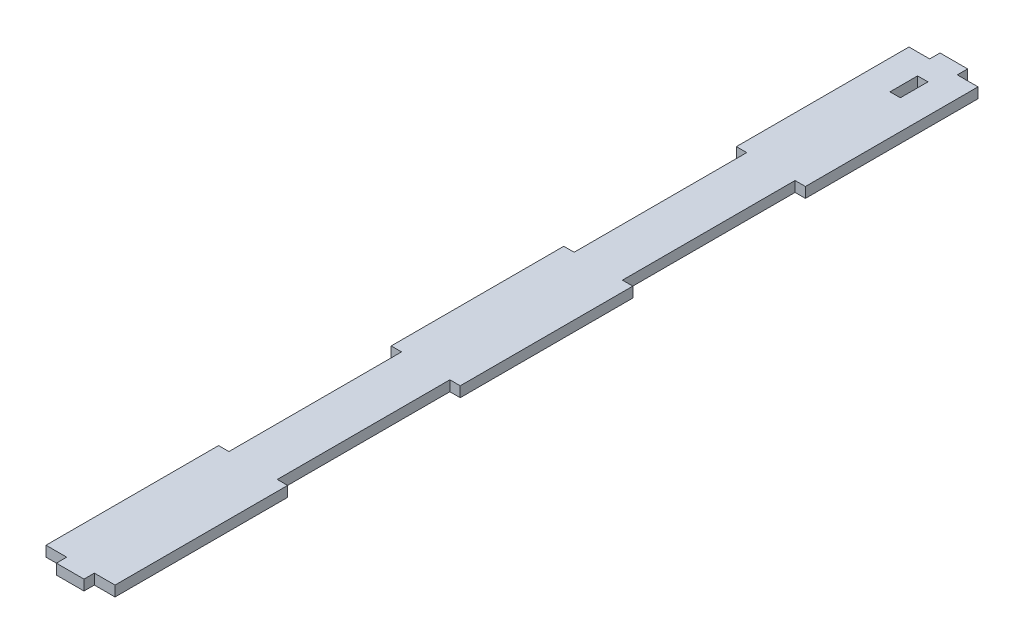
ISO-10303-21;
HEADER;
FILE_DESCRIPTION(('STEP AP214'),'2;1');
FILE_NAME('part.step','',(''),(''),'','','');
FILE_SCHEMA(('AUTOMOTIVE_DESIGN { 1 0 10303 214 1 1 1 1 }'));
ENDSEC;
DATA;
#1=APPLICATION_CONTEXT('core data for automotive mechanical design processes');
#2=APPLICATION_PROTOCOL_DEFINITION('international standard','automotive_design',2000,#1);
#3=PRODUCT_CONTEXT('',#1,'mechanical');
#4=PRODUCT('Part','Part','',(#3));
#5=PRODUCT_RELATED_PRODUCT_CATEGORY('part','',(#4));
#6=PRODUCT_DEFINITION_FORMATION('','',#4);
#7=PRODUCT_DEFINITION_CONTEXT('part definition',#1,'design');
#8=PRODUCT_DEFINITION('design','',#6,#7);
#9=PRODUCT_DEFINITION_SHAPE('','',#8);
#10=(LENGTH_UNIT() NAMED_UNIT(*) SI_UNIT(.MILLI.,.METRE.));
#11=(NAMED_UNIT(*) PLANE_ANGLE_UNIT() SI_UNIT($,.RADIAN.));
#12=(NAMED_UNIT(*) SI_UNIT($,.STERADIAN.) SOLID_ANGLE_UNIT());
#13=UNCERTAINTY_MEASURE_WITH_UNIT(LENGTH_MEASURE(1.E-05),#10,'distance_accuracy_value','');
#14=(GEOMETRIC_REPRESENTATION_CONTEXT(3) GLOBAL_UNCERTAINTY_ASSIGNED_CONTEXT((#13)) GLOBAL_UNIT_ASSIGNED_CONTEXT((#10,
#11,#12)) REPRESENTATION_CONTEXT('',''));
#15=CARTESIAN_POINT('',(0.,0.,0.));
#16=DIRECTION('',(0.,0.,1.));
#17=DIRECTION('',(1.,0.,0.));
#18=AXIS2_PLACEMENT_3D('',#15,#16,#17);
#19=CARTESIAN_POINT('',(14.,3.,0.));
#20=DIRECTION('',(1.,0.,0.));
#21=DIRECTION('',(0.,0.,-1.));
#22=AXIS2_PLACEMENT_3D('',#19,#20,#21);
#23=PLANE('',#22);
#24=DIRECTION('',(0.,0.,1.));
#25=VECTOR('',#24,1.);
#26=CARTESIAN_POINT('',(14.,0.,0.));
#27=LINE('',#26,#25);
#28=CARTESIAN_POINT('',(14.,0.,-253.));
#29=VERTEX_POINT('',#28);
#30=CARTESIAN_POINT('',(14.,0.,-250.));
#31=VERTEX_POINT('',#30);
#32=EDGE_CURVE('E428',#29,#31,#27,.T.);
#33=ORIENTED_EDGE('',*,*,#32,.F.);
#34=DIRECTION('',(0.,-1.,0.));
#35=VECTOR('',#34,1.);
#36=CARTESIAN_POINT('',(14.,3.,-253.));
#37=LINE('',#36,#35);
#38=CARTESIAN_POINT('',(14.,3.,-253.));
#39=VERTEX_POINT('',#38);
#40=EDGE_CURVE('E11',#39,#29,#37,.T.);
#41=ORIENTED_EDGE('',*,*,#40,.F.);
#42=DIRECTION('',(0.,0.,1.));
#43=VECTOR('',#42,1.);
#44=CARTESIAN_POINT('',(14.,3.,0.));
#45=LINE('',#44,#43);
#46=CARTESIAN_POINT('',(14.,3.,-250.));
#47=VERTEX_POINT('',#46);
#48=EDGE_CURVE('E510',#39,#47,#45,.T.);
#49=ORIENTED_EDGE('',*,*,#48,.T.);
#50=DIRECTION('',(0.,-1.,0.));
#51=VECTOR('',#50,1.);
#52=CARTESIAN_POINT('',(14.,3.,-250.));
#53=LINE('',#52,#51);
#54=EDGE_CURVE('E53',#47,#31,#53,.T.);
#55=ORIENTED_EDGE('',*,*,#54,.T.);
#56=EDGE_LOOP('',(#33,#41,#49,#55));
#57=FACE_BOUND('',#56,.T.);
#58=ADVANCED_FACE('F34',(#57),#23,.T.);
#59=CARTESIAN_POINT('',(0.,3.,-253.));
#60=DIRECTION('',(0.,0.,1.));
#61=DIRECTION('',(1.,0.,0.));
#62=AXIS2_PLACEMENT_3D('',#59,#60,#61);
#63=PLANE('',#62);
#64=DIRECTION('',(-1.,0.,0.));
#65=VECTOR('',#64,1.);
#66=CARTESIAN_POINT('',(0.,0.,-253.));
#67=LINE('',#66,#65);
#68=CARTESIAN_POINT('',(6.,0.,-253.));
#69=VERTEX_POINT('',#68);
#70=EDGE_CURVE('E425',#29,#69,#67,.T.);
#71=ORIENTED_EDGE('',*,*,#70,.T.);
#72=DIRECTION('',(0.,-1.,0.));
#73=VECTOR('',#72,1.);
#74=CARTESIAN_POINT('',(6.,3.,-253.));
#75=LINE('',#74,#73);
#76=CARTESIAN_POINT('',(6.,3.,-253.));
#77=VERTEX_POINT('',#76);
#78=EDGE_CURVE('E44',#77,#69,#75,.T.);
#79=ORIENTED_EDGE('',*,*,#78,.F.);
#80=DIRECTION('',(-1.,0.,0.));
#81=VECTOR('',#80,1.);
#82=CARTESIAN_POINT('',(0.,3.,-253.));
#83=LINE('',#82,#81);
#84=EDGE_CURVE('E507',#39,#77,#83,.T.);
#85=ORIENTED_EDGE('',*,*,#84,.F.);
#86=ORIENTED_EDGE('',*,*,#40,.T.);
#87=EDGE_LOOP('',(#71,#79,#85,#86));
#88=FACE_BOUND('',#87,.T.);
#89=ADVANCED_FACE('F540',(#88),#63,.F.);
#90=CARTESIAN_POINT('',(6.,3.,0.));
#91=DIRECTION('',(1.,0.,0.));
#92=DIRECTION('',(0.,0.,-1.));
#93=AXIS2_PLACEMENT_3D('',#90,#91,#92);
#94=PLANE('',#93);
#95=DIRECTION('',(0.,0.,1.));
#96=VECTOR('',#95,1.);
#97=CARTESIAN_POINT('',(6.,0.,0.));
#98=LINE('',#97,#96);
#99=CARTESIAN_POINT('',(6.,0.,-250.));
#100=VERTEX_POINT('',#99);
#101=EDGE_CURVE('E422',#69,#100,#98,.T.);
#102=ORIENTED_EDGE('',*,*,#101,.T.);
#103=DIRECTION('',(0.,-1.,0.));
#104=VECTOR('',#103,1.);
#105=CARTESIAN_POINT('',(6.,3.,-250.));
#106=LINE('',#105,#104);
#107=CARTESIAN_POINT('',(6.,3.,-250.));
#108=VERTEX_POINT('',#107);
#109=EDGE_CURVE('E333',#108,#100,#106,.T.);
#110=ORIENTED_EDGE('',*,*,#109,.F.);
#111=DIRECTION('',(0.,0.,1.));
#112=VECTOR('',#111,1.);
#113=CARTESIAN_POINT('',(6.,3.,0.));
#114=LINE('',#113,#112);
#115=EDGE_CURVE('E504',#77,#108,#114,.T.);
#116=ORIENTED_EDGE('',*,*,#115,.F.);
#117=ORIENTED_EDGE('',*,*,#78,.T.);
#118=EDGE_LOOP('',(#102,#110,#116,#117));
#119=FACE_BOUND('',#118,.T.);
#120=ADVANCED_FACE('F545',(#119),#94,.F.);
#121=CARTESIAN_POINT('',(0.,3.,-250.));
#122=DIRECTION('',(0.,0.,1.));
#123=DIRECTION('',(1.,0.,0.));
#124=AXIS2_PLACEMENT_3D('',#121,#122,#123);
#125=PLANE('',#124);
#126=DIRECTION('',(-1.,0.,0.));
#127=VECTOR('',#126,1.);
#128=CARTESIAN_POINT('',(0.,0.,-250.));
#129=LINE('',#128,#127);
#130=CARTESIAN_POINT('',(0.,0.,-250.));
#131=VERTEX_POINT('',#130);
#132=EDGE_CURVE('E419',#100,#131,#129,.T.);
#133=ORIENTED_EDGE('',*,*,#132,.T.);
#134=DIRECTION('',(0.,-1.,0.));
#135=VECTOR('',#134,1.);
#136=CARTESIAN_POINT('',(0.,3.,-250.));
#137=LINE('',#136,#135);
#138=CARTESIAN_POINT('',(0.,3.,-250.));
#139=VERTEX_POINT('',#138);
#140=EDGE_CURVE('E330',#139,#131,#137,.T.);
#141=ORIENTED_EDGE('',*,*,#140,.F.);
#142=DIRECTION('',(-1.,0.,0.));
#143=VECTOR('',#142,1.);
#144=CARTESIAN_POINT('',(0.,3.,-250.));
#145=LINE('',#144,#143);
#146=EDGE_CURVE('E501',#108,#139,#145,.T.);
#147=ORIENTED_EDGE('',*,*,#146,.F.);
#148=ORIENTED_EDGE('',*,*,#109,.T.);
#149=EDGE_LOOP('',(#133,#141,#147,#148));
#150=FACE_BOUND('',#149,.T.);
#151=ADVANCED_FACE('F551',(#150),#125,.F.);
#152=CARTESIAN_POINT('',(0.,3.,0.));
#153=DIRECTION('',(1.,0.,0.));
#154=DIRECTION('',(0.,0.,-1.));
#155=AXIS2_PLACEMENT_3D('',#152,#153,#154);
#156=PLANE('',#155);
#157=DIRECTION('',(0.,0.,1.));
#158=VECTOR('',#157,1.);
#159=CARTESIAN_POINT('',(0.,0.,0.));
#160=LINE('',#159,#158);
#161=CARTESIAN_POINT('',(0.,0.,-200.));
#162=VERTEX_POINT('',#161);
#163=EDGE_CURVE('E416',#131,#162,#160,.T.);
#164=ORIENTED_EDGE('',*,*,#163,.T.);
#165=DIRECTION('',(0.,-1.,0.));
#166=VECTOR('',#165,1.);
#167=CARTESIAN_POINT('',(0.,3.,-200.));
#168=LINE('',#167,#166);
#169=CARTESIAN_POINT('',(0.,3.,-200.));
#170=VERTEX_POINT('',#169);
#171=EDGE_CURVE('E327',#170,#162,#168,.T.);
#172=ORIENTED_EDGE('',*,*,#171,.F.);
#173=DIRECTION('',(0.,0.,1.));
#174=VECTOR('',#173,1.);
#175=CARTESIAN_POINT('',(0.,3.,0.));
#176=LINE('',#175,#174);
#177=EDGE_CURVE('E498',#139,#170,#176,.T.);
#178=ORIENTED_EDGE('',*,*,#177,.F.);
#179=ORIENTED_EDGE('',*,*,#140,.T.);
#180=EDGE_LOOP('',(#164,#172,#178,#179));
#181=FACE_BOUND('',#180,.T.);
#182=ADVANCED_FACE('F555',(#181),#156,.F.);
#183=CARTESIAN_POINT('',(3.70074341541719E-12,3.,-200.));
#184=DIRECTION('',(0.,0.,-1.));
#185=DIRECTION('',(-1.,0.,0.));
#186=AXIS2_PLACEMENT_3D('',#183,#184,#185);
#187=PLANE('',#186);
#188=DIRECTION('',(1.,0.,0.));
#189=VECTOR('',#188,1.);
#190=CARTESIAN_POINT('',(3.70074341541719E-12,0.,-200.));
#191=LINE('',#190,#189);
#192=CARTESIAN_POINT('',(3.,0.,-200.));
#193=VERTEX_POINT('',#192);
#194=EDGE_CURVE('E413',#162,#193,#191,.T.);
#195=ORIENTED_EDGE('',*,*,#194,.T.);
#196=DIRECTION('',(0.,-1.,0.));
#197=VECTOR('',#196,1.);
#198=CARTESIAN_POINT('',(3.,3.,-200.));
#199=LINE('',#198,#197);
#200=CARTESIAN_POINT('',(3.,3.,-200.));
#201=VERTEX_POINT('',#200);
#202=EDGE_CURVE('E324',#201,#193,#199,.T.);
#203=ORIENTED_EDGE('',*,*,#202,.F.);
#204=DIRECTION('',(1.,0.,0.));
#205=VECTOR('',#204,1.);
#206=CARTESIAN_POINT('',(3.70074341541719E-12,3.,-200.));
#207=LINE('',#206,#205);
#208=EDGE_CURVE('E495',#170,#201,#207,.T.);
#209=ORIENTED_EDGE('',*,*,#208,.F.);
#210=ORIENTED_EDGE('',*,*,#171,.T.);
#211=EDGE_LOOP('',(#195,#203,#209,#210));
#212=FACE_BOUND('',#211,.T.);
#213=ADVANCED_FACE('F559',(#212),#187,.F.);
#214=CARTESIAN_POINT('',(3.00000000000002,3.,0.));
#215=DIRECTION('',(1.,0.,0.));
#216=DIRECTION('',(0.,0.,-1.));
#217=AXIS2_PLACEMENT_3D('',#214,#215,#216);
#218=PLANE('',#217);
#219=DIRECTION('',(0.,0.,1.));
#220=VECTOR('',#219,1.);
#221=CARTESIAN_POINT('',(3.00000000000002,0.,0.));
#222=LINE('',#221,#220);
#223=CARTESIAN_POINT('',(3.,0.,-150.));
#224=VERTEX_POINT('',#223);
#225=EDGE_CURVE('E410',#193,#224,#222,.T.);
#226=ORIENTED_EDGE('',*,*,#225,.T.);
#227=DIRECTION('',(0.,-1.,0.));
#228=VECTOR('',#227,1.);
#229=CARTESIAN_POINT('',(3.,3.,-150.));
#230=LINE('',#229,#228);
#231=CARTESIAN_POINT('',(3.,3.,-150.));
#232=VERTEX_POINT('',#231);
#233=EDGE_CURVE('E321',#232,#224,#230,.T.);
#234=ORIENTED_EDGE('',*,*,#233,.F.);
#235=DIRECTION('',(0.,0.,1.));
#236=VECTOR('',#235,1.);
#237=CARTESIAN_POINT('',(3.00000000000002,3.,0.));
#238=LINE('',#237,#236);
#239=EDGE_CURVE('E492',#201,#232,#238,.T.);
#240=ORIENTED_EDGE('',*,*,#239,.F.);
#241=ORIENTED_EDGE('',*,*,#202,.T.);
#242=EDGE_LOOP('',(#226,#234,#240,#241));
#243=FACE_BOUND('',#242,.T.);
#244=ADVANCED_FACE('F563',(#243),#218,.F.);
#245=CARTESIAN_POINT('',(-1.38777878078144E-12,3.,-150.));
#246=DIRECTION('',(0.,0.,1.));
#247=DIRECTION('',(1.,0.,0.));
#248=AXIS2_PLACEMENT_3D('',#245,#246,#247);
#249=PLANE('',#248);
#250=DIRECTION('',(-1.,0.,0.));
#251=VECTOR('',#250,1.);
#252=CARTESIAN_POINT('',(-1.38777878078144E-12,0.,-150.));
#253=LINE('',#252,#251);
#254=CARTESIAN_POINT('',(0.,0.,-150.));
#255=VERTEX_POINT('',#254);
#256=EDGE_CURVE('E407',#224,#255,#253,.T.);
#257=ORIENTED_EDGE('',*,*,#256,.T.);
#258=DIRECTION('',(0.,-1.,0.));
#259=VECTOR('',#258,1.);
#260=CARTESIAN_POINT('',(0.,3.,-150.));
#261=LINE('',#260,#259);
#262=CARTESIAN_POINT('',(0.,3.,-150.));
#263=VERTEX_POINT('',#262);
#264=EDGE_CURVE('E318',#263,#255,#261,.T.);
#265=ORIENTED_EDGE('',*,*,#264,.F.);
#266=DIRECTION('',(-1.,0.,0.));
#267=VECTOR('',#266,1.);
#268=CARTESIAN_POINT('',(-1.38777878078144E-12,3.,-150.));
#269=LINE('',#268,#267);
#270=EDGE_CURVE('E489',#232,#263,#269,.T.);
#271=ORIENTED_EDGE('',*,*,#270,.F.);
#272=ORIENTED_EDGE('',*,*,#233,.T.);
#273=EDGE_LOOP('',(#257,#265,#271,#272));
#274=FACE_BOUND('',#273,.T.);
#275=ADVANCED_FACE('F567',(#274),#249,.F.);
#276=CARTESIAN_POINT('',(0.,3.,0.));
#277=DIRECTION('',(1.,0.,0.));
#278=DIRECTION('',(0.,0.,-1.));
#279=AXIS2_PLACEMENT_3D('',#276,#277,#278);
#280=PLANE('',#279);
#281=DIRECTION('',(0.,0.,1.));
#282=VECTOR('',#281,1.);
#283=CARTESIAN_POINT('',(0.,0.,0.));
#284=LINE('',#283,#282);
#285=CARTESIAN_POINT('',(0.,0.,-100.));
#286=VERTEX_POINT('',#285);
#287=EDGE_CURVE('E404',#255,#286,#284,.T.);
#288=ORIENTED_EDGE('',*,*,#287,.T.);
#289=DIRECTION('',(0.,-1.,0.));
#290=VECTOR('',#289,1.);
#291=CARTESIAN_POINT('',(0.,3.,-100.));
#292=LINE('',#291,#290);
#293=CARTESIAN_POINT('',(0.,3.,-100.));
#294=VERTEX_POINT('',#293);
#295=EDGE_CURVE('E315',#294,#286,#292,.T.);
#296=ORIENTED_EDGE('',*,*,#295,.F.);
#297=DIRECTION('',(0.,0.,1.));
#298=VECTOR('',#297,1.);
#299=CARTESIAN_POINT('',(0.,3.,0.));
#300=LINE('',#299,#298);
#301=EDGE_CURVE('E486',#263,#294,#300,.T.);
#302=ORIENTED_EDGE('',*,*,#301,.F.);
#303=ORIENTED_EDGE('',*,*,#264,.T.);
#304=EDGE_LOOP('',(#288,#296,#302,#303));
#305=FACE_BOUND('',#304,.T.);
#306=ADVANCED_FACE('F571',(#305),#280,.F.);
#307=CARTESIAN_POINT('',(0.,3.,-100.));
#308=DIRECTION('',(0.,0.,-1.));
#309=DIRECTION('',(-1.,0.,0.));
#310=AXIS2_PLACEMENT_3D('',#307,#308,#309);
#311=PLANE('',#310);
#312=DIRECTION('',(1.,0.,0.));
#313=VECTOR('',#312,1.);
#314=CARTESIAN_POINT('',(0.,0.,-100.));
#315=LINE('',#314,#313);
#316=CARTESIAN_POINT('',(3.,0.,-100.));
#317=VERTEX_POINT('',#316);
#318=EDGE_CURVE('E401',#286,#317,#315,.T.);
#319=ORIENTED_EDGE('',*,*,#318,.T.);
#320=DIRECTION('',(0.,-1.,0.));
#321=VECTOR('',#320,1.);
#322=CARTESIAN_POINT('',(3.,3.,-100.));
#323=LINE('',#322,#321);
#324=CARTESIAN_POINT('',(3.,3.,-100.));
#325=VERTEX_POINT('',#324);
#326=EDGE_CURVE('E312',#325,#317,#323,.T.);
#327=ORIENTED_EDGE('',*,*,#326,.F.);
#328=DIRECTION('',(1.,0.,0.));
#329=VECTOR('',#328,1.);
#330=CARTESIAN_POINT('',(0.,3.,-100.));
#331=LINE('',#330,#329);
#332=EDGE_CURVE('E483',#294,#325,#331,.T.);
#333=ORIENTED_EDGE('',*,*,#332,.F.);
#334=ORIENTED_EDGE('',*,*,#295,.T.);
#335=EDGE_LOOP('',(#319,#327,#333,#334));
#336=FACE_BOUND('',#335,.T.);
#337=ADVANCED_FACE('F575',(#336),#311,.F.);
#338=CARTESIAN_POINT('',(3.,3.,0.));
#339=DIRECTION('',(1.,0.,0.));
#340=DIRECTION('',(0.,0.,-1.));
#341=AXIS2_PLACEMENT_3D('',#338,#339,#340);
#342=PLANE('',#341);
#343=DIRECTION('',(0.,0.,1.));
#344=VECTOR('',#343,1.);
#345=CARTESIAN_POINT('',(3.,0.,0.));
#346=LINE('',#345,#344);
#347=CARTESIAN_POINT('',(3.,0.,-50.));
#348=VERTEX_POINT('',#347);
#349=EDGE_CURVE('E398',#317,#348,#346,.T.);
#350=ORIENTED_EDGE('',*,*,#349,.T.);
#351=DIRECTION('',(0.,-1.,0.));
#352=VECTOR('',#351,1.);
#353=CARTESIAN_POINT('',(3.,3.,-50.));
#354=LINE('',#353,#352);
#355=CARTESIAN_POINT('',(3.,3.,-50.));
#356=VERTEX_POINT('',#355);
#357=EDGE_CURVE('E309',#356,#348,#354,.T.);
#358=ORIENTED_EDGE('',*,*,#357,.F.);
#359=DIRECTION('',(0.,0.,1.));
#360=VECTOR('',#359,1.);
#361=CARTESIAN_POINT('',(3.,3.,0.));
#362=LINE('',#361,#360);
#363=EDGE_CURVE('E480',#325,#356,#362,.T.);
#364=ORIENTED_EDGE('',*,*,#363,.F.);
#365=ORIENTED_EDGE('',*,*,#326,.T.);
#366=EDGE_LOOP('',(#350,#358,#364,#365));
#367=FACE_BOUND('',#366,.T.);
#368=ADVANCED_FACE('F579',(#367),#342,.F.);
#369=CARTESIAN_POINT('',(0.,3.,-50.));
#370=DIRECTION('',(0.,0.,1.));
#371=DIRECTION('',(1.,0.,0.));
#372=AXIS2_PLACEMENT_3D('',#369,#370,#371);
#373=PLANE('',#372);
#374=DIRECTION('',(-1.,0.,0.));
#375=VECTOR('',#374,1.);
#376=CARTESIAN_POINT('',(0.,0.,-50.));
#377=LINE('',#376,#375);
#378=CARTESIAN_POINT('',(0.,0.,-50.));
#379=VERTEX_POINT('',#378);
#380=EDGE_CURVE('E395',#348,#379,#377,.T.);
#381=ORIENTED_EDGE('',*,*,#380,.T.);
#382=DIRECTION('',(0.,-1.,0.));
#383=VECTOR('',#382,1.);
#384=CARTESIAN_POINT('',(0.,3.,-50.));
#385=LINE('',#384,#383);
#386=CARTESIAN_POINT('',(0.,3.,-50.));
#387=VERTEX_POINT('',#386);
#388=EDGE_CURVE('E306',#387,#379,#385,.T.);
#389=ORIENTED_EDGE('',*,*,#388,.F.);
#390=DIRECTION('',(-1.,0.,0.));
#391=VECTOR('',#390,1.);
#392=CARTESIAN_POINT('',(0.,3.,-50.));
#393=LINE('',#392,#391);
#394=EDGE_CURVE('E477',#356,#387,#393,.T.);
#395=ORIENTED_EDGE('',*,*,#394,.F.);
#396=ORIENTED_EDGE('',*,*,#357,.T.);
#397=EDGE_LOOP('',(#381,#389,#395,#396));
#398=FACE_BOUND('',#397,.T.);
#399=ADVANCED_FACE('F583',(#398),#373,.F.);
#400=CARTESIAN_POINT('',(0.,3.,0.));
#401=DIRECTION('',(1.,0.,0.));
#402=DIRECTION('',(0.,0.,-1.));
#403=AXIS2_PLACEMENT_3D('',#400,#401,#402);
#404=PLANE('',#403);
#405=DIRECTION('',(0.,0.,1.));
#406=VECTOR('',#405,1.);
#407=CARTESIAN_POINT('',(0.,0.,0.));
#408=LINE('',#407,#406);
#409=CARTESIAN_POINT('',(0.,0.,0.));
#410=VERTEX_POINT('',#409);
#411=EDGE_CURVE('E392',#379,#410,#408,.T.);
#412=ORIENTED_EDGE('',*,*,#411,.T.);
#413=DIRECTION('',(0.,-1.,0.));
#414=VECTOR('',#413,1.);
#415=CARTESIAN_POINT('',(0.,3.,0.));
#416=LINE('',#415,#414);
#417=CARTESIAN_POINT('',(0.,3.,0.));
#418=VERTEX_POINT('',#417);
#419=EDGE_CURVE('E303',#418,#410,#416,.T.);
#420=ORIENTED_EDGE('',*,*,#419,.F.);
#421=DIRECTION('',(0.,0.,1.));
#422=VECTOR('',#421,1.);
#423=CARTESIAN_POINT('',(0.,3.,0.));
#424=LINE('',#423,#422);
#425=EDGE_CURVE('E474',#387,#418,#424,.T.);
#426=ORIENTED_EDGE('',*,*,#425,.F.);
#427=ORIENTED_EDGE('',*,*,#388,.T.);
#428=EDGE_LOOP('',(#412,#420,#426,#427));
#429=FACE_BOUND('',#428,.T.);
#430=ADVANCED_FACE('F587',(#429),#404,.F.);
#431=CARTESIAN_POINT('',(0.,3.,0.));
#432=DIRECTION('',(0.,0.,-1.));
#433=DIRECTION('',(-1.,0.,0.));
#434=AXIS2_PLACEMENT_3D('',#431,#432,#433);
#435=PLANE('',#434);
#436=DIRECTION('',(1.,0.,0.));
#437=VECTOR('',#436,1.);
#438=CARTESIAN_POINT('',(0.,0.,0.));
#439=LINE('',#438,#437);
#440=CARTESIAN_POINT('',(6.,0.,0.));
#441=VERTEX_POINT('',#440);
#442=EDGE_CURVE('E389',#410,#441,#439,.T.);
#443=ORIENTED_EDGE('',*,*,#442,.T.);
#444=DIRECTION('',(0.,-1.,0.));
#445=VECTOR('',#444,1.);
#446=CARTESIAN_POINT('',(6.,3.,0.));
#447=LINE('',#446,#445);
#448=CARTESIAN_POINT('',(6.,3.,0.));
#449=VERTEX_POINT('',#448);
#450=EDGE_CURVE('E301',#449,#441,#447,.T.);
#451=ORIENTED_EDGE('',*,*,#450,.F.);
#452=DIRECTION('',(1.,0.,0.));
#453=VECTOR('',#452,1.);
#454=CARTESIAN_POINT('',(0.,3.,0.));
#455=LINE('',#454,#453);
#456=EDGE_CURVE('E472',#418,#449,#455,.T.);
#457=ORIENTED_EDGE('',*,*,#456,.F.);
#458=ORIENTED_EDGE('',*,*,#419,.T.);
#459=EDGE_LOOP('',(#443,#451,#457,#458));
#460=FACE_BOUND('',#459,.T.);
#461=ADVANCED_FACE('F591',(#460),#435,.F.);
#462=CARTESIAN_POINT('',(6.,3.,0.));
#463=DIRECTION('',(-1.,0.,0.));
#464=DIRECTION('',(0.,0.,1.));
#465=AXIS2_PLACEMENT_3D('',#462,#463,#464);
#466=PLANE('',#465);
#467=DIRECTION('',(0.,0.,-1.));
#468=VECTOR('',#467,1.);
#469=CARTESIAN_POINT('',(6.,0.,0.));
#470=LINE('',#469,#468);
#471=CARTESIAN_POINT('',(6.,0.,2.99999999999999));
#472=VERTEX_POINT('',#471);
#473=EDGE_CURVE('E386',#472,#441,#470,.T.);
#474=ORIENTED_EDGE('',*,*,#473,.F.);
#475=DIRECTION('',(0.,-1.,0.));
#476=VECTOR('',#475,1.);
#477=CARTESIAN_POINT('',(6.,3.,2.99999999999999));
#478=LINE('',#477,#476);
#479=CARTESIAN_POINT('',(6.,3.,2.99999999999999));
#480=VERTEX_POINT('',#479);
#481=EDGE_CURVE('E299',#480,#472,#478,.T.);
#482=ORIENTED_EDGE('',*,*,#481,.F.);
#483=DIRECTION('',(0.,0.,-1.));
#484=VECTOR('',#483,1.);
#485=CARTESIAN_POINT('',(6.,3.,0.));
#486=LINE('',#485,#484);
#487=EDGE_CURVE('E469',#480,#449,#486,.T.);
#488=ORIENTED_EDGE('',*,*,#487,.T.);
#489=ORIENTED_EDGE('',*,*,#450,.T.);
#490=EDGE_LOOP('',(#474,#482,#488,#489));
#491=FACE_BOUND('',#490,.T.);
#492=ADVANCED_FACE('F595',(#491),#466,.T.);
#493=CARTESIAN_POINT('',(0.,3.,2.99999999999999));
#494=DIRECTION('',(0.,0.,1.));
#495=DIRECTION('',(1.,0.,0.));
#496=AXIS2_PLACEMENT_3D('',#493,#494,#495);
#497=PLANE('',#496);
#498=DIRECTION('',(-1.,0.,0.));
#499=VECTOR('',#498,1.);
#500=CARTESIAN_POINT('',(0.,0.,2.99999999999999));
#501=LINE('',#500,#499);
#502=CARTESIAN_POINT('',(14.,0.,2.99999999999999));
#503=VERTEX_POINT('',#502);
#504=EDGE_CURVE('E383',#503,#472,#501,.T.);
#505=ORIENTED_EDGE('',*,*,#504,.F.);
#506=DIRECTION('',(0.,-1.,0.));
#507=VECTOR('',#506,1.);
#508=CARTESIAN_POINT('',(14.,3.,2.99999999999999));
#509=LINE('',#508,#507);
#510=CARTESIAN_POINT('',(14.,3.,2.99999999999999));
#511=VERTEX_POINT('',#510);
#512=EDGE_CURVE('E297',#511,#503,#509,.T.);
#513=ORIENTED_EDGE('',*,*,#512,.F.);
#514=DIRECTION('',(-1.,0.,0.));
#515=VECTOR('',#514,1.);
#516=CARTESIAN_POINT('',(0.,3.,2.99999999999999));
#517=LINE('',#516,#515);
#518=EDGE_CURVE('E466',#511,#480,#517,.T.);
#519=ORIENTED_EDGE('',*,*,#518,.T.);
#520=ORIENTED_EDGE('',*,*,#481,.T.);
#521=EDGE_LOOP('',(#505,#513,#519,#520));
#522=FACE_BOUND('',#521,.T.);
#523=ADVANCED_FACE('F599',(#522),#497,.T.);
#524=CARTESIAN_POINT('',(14.,3.,0.));
#525=DIRECTION('',(-1.,0.,0.));
#526=DIRECTION('',(0.,0.,1.));
#527=AXIS2_PLACEMENT_3D('',#524,#525,#526);
#528=PLANE('',#527);
#529=DIRECTION('',(0.,0.,-1.));
#530=VECTOR('',#529,1.);
#531=CARTESIAN_POINT('',(14.,0.,0.));
#532=LINE('',#531,#530);
#533=CARTESIAN_POINT('',(14.,0.,0.));
#534=VERTEX_POINT('',#533);
#535=EDGE_CURVE('E380',#503,#534,#532,.T.);
#536=ORIENTED_EDGE('',*,*,#535,.T.);
#537=DIRECTION('',(0.,-1.,0.));
#538=VECTOR('',#537,1.);
#539=CARTESIAN_POINT('',(14.,3.,0.));
#540=LINE('',#539,#538);
#541=CARTESIAN_POINT('',(14.,3.,0.));
#542=VERTEX_POINT('',#541);
#543=EDGE_CURVE('E294',#542,#534,#540,.T.);
#544=ORIENTED_EDGE('',*,*,#543,.F.);
#545=DIRECTION('',(0.,0.,-1.));
#546=VECTOR('',#545,1.);
#547=CARTESIAN_POINT('',(14.,3.,0.));
#548=LINE('',#547,#546);
#549=EDGE_CURVE('E463',#511,#542,#548,.T.);
#550=ORIENTED_EDGE('',*,*,#549,.F.);
#551=ORIENTED_EDGE('',*,*,#512,.T.);
#552=EDGE_LOOP('',(#536,#544,#550,#551));
#553=FACE_BOUND('',#552,.T.);
#554=ADVANCED_FACE('F603',(#553),#528,.F.);
#555=CARTESIAN_POINT('',(0.,3.,0.));
#556=DIRECTION('',(0.,0.,-1.));
#557=DIRECTION('',(-1.,0.,0.));
#558=AXIS2_PLACEMENT_3D('',#555,#556,#557);
#559=PLANE('',#558);
#560=DIRECTION('',(1.,0.,0.));
#561=VECTOR('',#560,1.);
#562=CARTESIAN_POINT('',(0.,0.,0.));
#563=LINE('',#562,#561);
#564=CARTESIAN_POINT('',(20.,0.,0.));
#565=VERTEX_POINT('',#564);
#566=EDGE_CURVE('E377',#534,#565,#563,.T.);
#567=ORIENTED_EDGE('',*,*,#566,.T.);
#568=DIRECTION('',(0.,-1.,0.));
#569=VECTOR('',#568,1.);
#570=CARTESIAN_POINT('',(20.,3.,0.));
#571=LINE('',#570,#569);
#572=CARTESIAN_POINT('',(20.,3.,0.));
#573=VERTEX_POINT('',#572);
#574=EDGE_CURVE('E292',#573,#565,#571,.T.);
#575=ORIENTED_EDGE('',*,*,#574,.F.);
#576=DIRECTION('',(1.,0.,0.));
#577=VECTOR('',#576,1.);
#578=CARTESIAN_POINT('',(0.,3.,0.));
#579=LINE('',#578,#577);
#580=EDGE_CURVE('E461',#542,#573,#579,.T.);
#581=ORIENTED_EDGE('',*,*,#580,.F.);
#582=ORIENTED_EDGE('',*,*,#543,.T.);
#583=EDGE_LOOP('',(#567,#575,#581,#582));
#584=FACE_BOUND('',#583,.T.);
#585=ADVANCED_FACE('F607',(#584),#559,.F.);
#586=CARTESIAN_POINT('',(20.,3.,0.));
#587=DIRECTION('',(1.,0.,0.));
#588=DIRECTION('',(0.,0.,-1.));
#589=AXIS2_PLACEMENT_3D('',#586,#587,#588);
#590=PLANE('',#589);
#591=DIRECTION('',(0.,0.,1.));
#592=VECTOR('',#591,1.);
#593=CARTESIAN_POINT('',(20.,0.,0.));
#594=LINE('',#593,#592);
#595=CARTESIAN_POINT('',(20.,0.,-50.));
#596=VERTEX_POINT('',#595);
#597=EDGE_CURVE('E374',#596,#565,#594,.T.);
#598=ORIENTED_EDGE('',*,*,#597,.F.);
#599=DIRECTION('',(0.,-1.,0.));
#600=VECTOR('',#599,1.);
#601=CARTESIAN_POINT('',(20.,3.,-50.));
#602=LINE('',#601,#600);
#603=CARTESIAN_POINT('',(20.,3.,-50.));
#604=VERTEX_POINT('',#603);
#605=EDGE_CURVE('E290',#604,#596,#602,.T.);
#606=ORIENTED_EDGE('',*,*,#605,.F.);
#607=DIRECTION('',(0.,0.,1.));
#608=VECTOR('',#607,1.);
#609=CARTESIAN_POINT('',(20.,3.,0.));
#610=LINE('',#609,#608);
#611=EDGE_CURVE('E458',#604,#573,#610,.T.);
#612=ORIENTED_EDGE('',*,*,#611,.T.);
#613=ORIENTED_EDGE('',*,*,#574,.T.);
#614=EDGE_LOOP('',(#598,#606,#612,#613));
#615=FACE_BOUND('',#614,.T.);
#616=ADVANCED_FACE('F611',(#615),#590,.T.);
#617=CARTESIAN_POINT('',(0.,3.,-50.));
#618=DIRECTION('',(0.,0.,-1.));
#619=DIRECTION('',(-1.,0.,0.));
#620=AXIS2_PLACEMENT_3D('',#617,#618,#619);
#621=PLANE('',#620);
#622=DIRECTION('',(1.,0.,0.));
#623=VECTOR('',#622,1.);
#624=CARTESIAN_POINT('',(0.,0.,-50.));
#625=LINE('',#624,#623);
#626=CARTESIAN_POINT('',(17.,0.,-50.));
#627=VERTEX_POINT('',#626);
#628=EDGE_CURVE('E371',#627,#596,#625,.T.);
#629=ORIENTED_EDGE('',*,*,#628,.F.);
#630=DIRECTION('',(0.,-1.,0.));
#631=VECTOR('',#630,1.);
#632=CARTESIAN_POINT('',(17.,3.,-50.));
#633=LINE('',#632,#631);
#634=CARTESIAN_POINT('',(17.,3.,-50.));
#635=VERTEX_POINT('',#634);
#636=EDGE_CURVE('E288',#635,#627,#633,.T.);
#637=ORIENTED_EDGE('',*,*,#636,.F.);
#638=DIRECTION('',(1.,0.,0.));
#639=VECTOR('',#638,1.);
#640=CARTESIAN_POINT('',(0.,3.,-50.));
#641=LINE('',#640,#639);
#642=EDGE_CURVE('E455',#635,#604,#641,.T.);
#643=ORIENTED_EDGE('',*,*,#642,.T.);
#644=ORIENTED_EDGE('',*,*,#605,.T.);
#645=EDGE_LOOP('',(#629,#637,#643,#644));
#646=FACE_BOUND('',#645,.T.);
#647=ADVANCED_FACE('F615',(#646),#621,.T.);
#648=CARTESIAN_POINT('',(17.,3.,0.));
#649=DIRECTION('',(1.,0.,0.));
#650=DIRECTION('',(0.,0.,-1.));
#651=AXIS2_PLACEMENT_3D('',#648,#649,#650);
#652=PLANE('',#651);
#653=DIRECTION('',(0.,0.,1.));
#654=VECTOR('',#653,1.);
#655=CARTESIAN_POINT('',(17.,0.,0.));
#656=LINE('',#655,#654);
#657=CARTESIAN_POINT('',(17.,0.,-100.));
#658=VERTEX_POINT('',#657);
#659=EDGE_CURVE('E368',#658,#627,#656,.T.);
#660=ORIENTED_EDGE('',*,*,#659,.F.);
#661=DIRECTION('',(0.,-1.,0.));
#662=VECTOR('',#661,1.);
#663=CARTESIAN_POINT('',(17.,3.,-100.));
#664=LINE('',#663,#662);
#665=CARTESIAN_POINT('',(17.,3.,-100.));
#666=VERTEX_POINT('',#665);
#667=EDGE_CURVE('E286',#666,#658,#664,.T.);
#668=ORIENTED_EDGE('',*,*,#667,.F.);
#669=DIRECTION('',(0.,0.,1.));
#670=VECTOR('',#669,1.);
#671=CARTESIAN_POINT('',(17.,3.,0.));
#672=LINE('',#671,#670);
#673=EDGE_CURVE('E452',#666,#635,#672,.T.);
#674=ORIENTED_EDGE('',*,*,#673,.T.);
#675=ORIENTED_EDGE('',*,*,#636,.T.);
#676=EDGE_LOOP('',(#660,#668,#674,#675));
#677=FACE_BOUND('',#676,.T.);
#678=ADVANCED_FACE('F619',(#677),#652,.T.);
#679=CARTESIAN_POINT('',(0.,3.,-100.));
#680=DIRECTION('',(0.,0.,1.));
#681=DIRECTION('',(1.,0.,0.));
#682=AXIS2_PLACEMENT_3D('',#679,#680,#681);
#683=PLANE('',#682);
#684=DIRECTION('',(-1.,0.,0.));
#685=VECTOR('',#684,1.);
#686=CARTESIAN_POINT('',(0.,0.,-100.));
#687=LINE('',#686,#685);
#688=CARTESIAN_POINT('',(20.,0.,-100.));
#689=VERTEX_POINT('',#688);
#690=EDGE_CURVE('E365',#689,#658,#687,.T.);
#691=ORIENTED_EDGE('',*,*,#690,.F.);
#692=DIRECTION('',(0.,-1.,0.));
#693=VECTOR('',#692,1.);
#694=CARTESIAN_POINT('',(20.,3.,-100.));
#695=LINE('',#694,#693);
#696=CARTESIAN_POINT('',(20.,3.,-100.));
#697=VERTEX_POINT('',#696);
#698=EDGE_CURVE('E284',#697,#689,#695,.T.);
#699=ORIENTED_EDGE('',*,*,#698,.F.);
#700=DIRECTION('',(-1.,0.,0.));
#701=VECTOR('',#700,1.);
#702=CARTESIAN_POINT('',(0.,3.,-100.));
#703=LINE('',#702,#701);
#704=EDGE_CURVE('E449',#697,#666,#703,.T.);
#705=ORIENTED_EDGE('',*,*,#704,.T.);
#706=ORIENTED_EDGE('',*,*,#667,.T.);
#707=EDGE_LOOP('',(#691,#699,#705,#706));
#708=FACE_BOUND('',#707,.T.);
#709=ADVANCED_FACE('F623',(#708),#683,.T.);
#710=CARTESIAN_POINT('',(20.,3.,0.));
#711=DIRECTION('',(-1.,0.,0.));
#712=DIRECTION('',(0.,0.,1.));
#713=AXIS2_PLACEMENT_3D('',#710,#711,#712);
#714=PLANE('',#713);
#715=DIRECTION('',(0.,0.,-1.));
#716=VECTOR('',#715,1.);
#717=CARTESIAN_POINT('',(20.,0.,0.));
#718=LINE('',#717,#716);
#719=CARTESIAN_POINT('',(20.,0.,-150.));
#720=VERTEX_POINT('',#719);
#721=EDGE_CURVE('E362',#689,#720,#718,.T.);
#722=ORIENTED_EDGE('',*,*,#721,.T.);
#723=DIRECTION('',(0.,-1.,0.));
#724=VECTOR('',#723,1.);
#725=CARTESIAN_POINT('',(20.,3.,-150.));
#726=LINE('',#725,#724);
#727=CARTESIAN_POINT('',(20.,3.,-150.));
#728=VERTEX_POINT('',#727);
#729=EDGE_CURVE('E281',#728,#720,#726,.T.);
#730=ORIENTED_EDGE('',*,*,#729,.F.);
#731=DIRECTION('',(0.,0.,-1.));
#732=VECTOR('',#731,1.);
#733=CARTESIAN_POINT('',(20.,3.,0.));
#734=LINE('',#733,#732);
#735=EDGE_CURVE('E446',#697,#728,#734,.T.);
#736=ORIENTED_EDGE('',*,*,#735,.F.);
#737=ORIENTED_EDGE('',*,*,#698,.T.);
#738=EDGE_LOOP('',(#722,#730,#736,#737));
#739=FACE_BOUND('',#738,.T.);
#740=ADVANCED_FACE('F627',(#739),#714,.F.);
#741=CARTESIAN_POINT('',(0.,3.,-150.));
#742=DIRECTION('',(0.,0.,1.));
#743=DIRECTION('',(1.,0.,0.));
#744=AXIS2_PLACEMENT_3D('',#741,#742,#743);
#745=PLANE('',#744);
#746=DIRECTION('',(-1.,0.,0.));
#747=VECTOR('',#746,1.);
#748=CARTESIAN_POINT('',(0.,0.,-150.));
#749=LINE('',#748,#747);
#750=CARTESIAN_POINT('',(17.,0.,-150.));
#751=VERTEX_POINT('',#750);
#752=EDGE_CURVE('E359',#720,#751,#749,.T.);
#753=ORIENTED_EDGE('',*,*,#752,.T.);
#754=DIRECTION('',(0.,-1.,0.));
#755=VECTOR('',#754,1.);
#756=CARTESIAN_POINT('',(17.,3.,-150.));
#757=LINE('',#756,#755);
#758=CARTESIAN_POINT('',(17.,3.,-150.));
#759=VERTEX_POINT('',#758);
#760=EDGE_CURVE('E274',#759,#751,#757,.T.);
#761=ORIENTED_EDGE('',*,*,#760,.F.);
#762=DIRECTION('',(-1.,0.,0.));
#763=VECTOR('',#762,1.);
#764=CARTESIAN_POINT('',(0.,3.,-150.));
#765=LINE('',#764,#763);
#766=EDGE_CURVE('E444',#728,#759,#765,.T.);
#767=ORIENTED_EDGE('',*,*,#766,.F.);
#768=ORIENTED_EDGE('',*,*,#729,.T.);
#769=EDGE_LOOP('',(#753,#761,#767,#768));
#770=FACE_BOUND('',#769,.T.);
#771=ADVANCED_FACE('F631',(#770),#745,.F.);
#772=CARTESIAN_POINT('',(17.,3.,0.));
#773=DIRECTION('',(-1.,0.,0.));
#774=DIRECTION('',(0.,0.,1.));
#775=AXIS2_PLACEMENT_3D('',#772,#773,#774);
#776=PLANE('',#775);
#777=DIRECTION('',(0.,0.,-1.));
#778=VECTOR('',#777,1.);
#779=CARTESIAN_POINT('',(17.,0.,0.));
#780=LINE('',#779,#778);
#781=CARTESIAN_POINT('',(17.,0.,-200.));
#782=VERTEX_POINT('',#781);
#783=EDGE_CURVE('E356',#751,#782,#780,.T.);
#784=ORIENTED_EDGE('',*,*,#783,.T.);
#785=DIRECTION('',(0.,-1.,0.));
#786=VECTOR('',#785,1.);
#787=CARTESIAN_POINT('',(17.,3.,-200.));
#788=LINE('',#787,#786);
#789=CARTESIAN_POINT('',(17.,3.,-200.));
#790=VERTEX_POINT('',#789);
#791=EDGE_CURVE('E272',#790,#782,#788,.T.);
#792=ORIENTED_EDGE('',*,*,#791,.F.);
#793=DIRECTION('',(0.,0.,-1.));
#794=VECTOR('',#793,1.);
#795=CARTESIAN_POINT('',(17.,3.,0.));
#796=LINE('',#795,#794);
#797=EDGE_CURVE('E265',#759,#790,#796,.T.);
#798=ORIENTED_EDGE('',*,*,#797,.F.);
#799=ORIENTED_EDGE('',*,*,#760,.T.);
#800=EDGE_LOOP('',(#784,#792,#798,#799));
#801=FACE_BOUND('',#800,.T.);
#802=ADVANCED_FACE('F635',(#801),#776,.F.);
#803=CARTESIAN_POINT('',(0.,3.,-200.));
#804=DIRECTION('',(0.,0.,-1.));
#805=DIRECTION('',(-1.,0.,0.));
#806=AXIS2_PLACEMENT_3D('',#803,#804,#805);
#807=PLANE('',#806);
#808=DIRECTION('',(1.,0.,0.));
#809=VECTOR('',#808,1.);
#810=CARTESIAN_POINT('',(0.,0.,-200.));
#811=LINE('',#810,#809);
#812=CARTESIAN_POINT('',(20.,0.,-200.));
#813=VERTEX_POINT('',#812);
#814=EDGE_CURVE('E271',#782,#813,#811,.T.);
#815=ORIENTED_EDGE('',*,*,#814,.T.);
#816=DIRECTION('',(0.,-1.,0.));
#817=VECTOR('',#816,1.);
#818=CARTESIAN_POINT('',(20.,3.,-200.));
#819=LINE('',#818,#817);
#820=CARTESIAN_POINT('',(20.,3.,-200.));
#821=VERTEX_POINT('',#820);
#822=EDGE_CURVE('E254',#821,#813,#819,.T.);
#823=ORIENTED_EDGE('',*,*,#822,.F.);
#824=DIRECTION('',(1.,0.,0.));
#825=VECTOR('',#824,1.);
#826=CARTESIAN_POINT('',(0.,3.,-200.));
#827=LINE('',#826,#825);
#828=EDGE_CURVE('E259',#790,#821,#827,.T.);
#829=ORIENTED_EDGE('',*,*,#828,.F.);
#830=ORIENTED_EDGE('',*,*,#791,.T.);
#831=EDGE_LOOP('',(#815,#823,#829,#830));
#832=FACE_BOUND('',#831,.T.);
#833=ADVANCED_FACE('F270',(#832),#807,.F.);
#834=CARTESIAN_POINT('',(20.,3.,0.));
#835=DIRECTION('',(-1.,0.,0.));
#836=DIRECTION('',(0.,0.,1.));
#837=AXIS2_PLACEMENT_3D('',#834,#835,#836);
#838=PLANE('',#837);
#839=DIRECTION('',(0.,0.,-1.));
#840=VECTOR('',#839,1.);
#841=CARTESIAN_POINT('',(20.,0.,0.));
#842=LINE('',#841,#840);
#843=CARTESIAN_POINT('',(20.,0.,-250.));
#844=VERTEX_POINT('',#843);
#845=EDGE_CURVE('E353',#813,#844,#842,.T.);
#846=ORIENTED_EDGE('',*,*,#845,.T.);
#847=DIRECTION('',(0.,-1.,0.));
#848=VECTOR('',#847,1.);
#849=CARTESIAN_POINT('',(20.,3.,-250.));
#850=LINE('',#849,#848);
#851=CARTESIAN_POINT('',(20.,3.,-250.));
#852=VERTEX_POINT('',#851);
#853=EDGE_CURVE('E151',#852,#844,#850,.T.);
#854=ORIENTED_EDGE('',*,*,#853,.F.);
#855=DIRECTION('',(0.,0.,-1.));
#856=VECTOR('',#855,1.);
#857=CARTESIAN_POINT('',(20.,3.,0.));
#858=LINE('',#857,#856);
#859=EDGE_CURVE('E250',#821,#852,#858,.T.);
#860=ORIENTED_EDGE('',*,*,#859,.F.);
#861=ORIENTED_EDGE('',*,*,#822,.T.);
#862=EDGE_LOOP('',(#846,#854,#860,#861));
#863=FACE_BOUND('',#862,.T.);
#864=ADVANCED_FACE('F252',(#863),#838,.F.);
#865=CARTESIAN_POINT('',(8.50000000000006,3.,0.));
#866=DIRECTION('',(1.,0.,0.));
#867=DIRECTION('',(0.,0.,-1.));
#868=AXIS2_PLACEMENT_3D('',#865,#866,#867);
#869=PLANE('',#868);
#870=DIRECTION('',(0.,0.,1.));
#871=VECTOR('',#870,1.);
#872=CARTESIAN_POINT('',(8.50000000000006,0.,0.));
#873=LINE('',#872,#871);
#874=CARTESIAN_POINT('',(8.5,0.,-244.));
#875=VERTEX_POINT('',#874);
#876=CARTESIAN_POINT('',(8.5,0.,-236.));
#877=VERTEX_POINT('',#876);
#878=EDGE_CURVE('E439',#875,#877,#873,.T.);
#879=ORIENTED_EDGE('',*,*,#878,.F.);
#880=DIRECTION('',(0.,-1.,0.));
#881=VECTOR('',#880,1.);
#882=CARTESIAN_POINT('',(8.5,3.,-244.));
#883=LINE('',#882,#881);
#884=CARTESIAN_POINT('',(8.5,3.,-244.));
#885=VERTEX_POINT('',#884);
#886=EDGE_CURVE('E38',#885,#875,#883,.T.);
#887=ORIENTED_EDGE('',*,*,#886,.F.);
#888=DIRECTION('',(0.,0.,1.));
#889=VECTOR('',#888,1.);
#890=CARTESIAN_POINT('',(8.50000000000006,3.,0.));
#891=LINE('',#890,#889);
#892=CARTESIAN_POINT('',(8.5,3.,-236.));
#893=VERTEX_POINT('',#892);
#894=EDGE_CURVE('E352',#885,#893,#891,.T.);
#895=ORIENTED_EDGE('',*,*,#894,.T.);
#896=DIRECTION('',(0.,-1.,0.));
#897=VECTOR('',#896,1.);
#898=CARTESIAN_POINT('',(8.5,3.,-236.));
#899=LINE('',#898,#897);
#900=EDGE_CURVE('E338',#893,#877,#899,.T.);
#901=ORIENTED_EDGE('',*,*,#900,.T.);
#902=EDGE_LOOP('',(#879,#887,#895,#901));
#903=FACE_BOUND('',#902,.T.);
#904=ADVANCED_FACE('F36',(#903),#869,.T.);
#905=CARTESIAN_POINT('',(0.,3.,-244.));
#906=DIRECTION('',(0.,0.,1.));
#907=DIRECTION('',(1.,0.,0.));
#908=AXIS2_PLACEMENT_3D('',#905,#906,#907);
#909=PLANE('',#908);
#910=DIRECTION('',(-1.,0.,0.));
#911=VECTOR('',#910,1.);
#912=CARTESIAN_POINT('',(0.,0.,-244.));
#913=LINE('',#912,#911);
#914=CARTESIAN_POINT('',(11.5,0.,-244.));
#915=VERTEX_POINT('',#914);
#916=EDGE_CURVE('E436',#915,#875,#913,.T.);
#917=ORIENTED_EDGE('',*,*,#916,.F.);
#918=DIRECTION('',(0.,-1.,0.));
#919=VECTOR('',#918,1.);
#920=CARTESIAN_POINT('',(11.5,3.,-244.));
#921=LINE('',#920,#919);
#922=CARTESIAN_POINT('',(11.5,3.,-244.));
#923=VERTEX_POINT('',#922);
#924=EDGE_CURVE('E341',#923,#915,#921,.T.);
#925=ORIENTED_EDGE('',*,*,#924,.F.);
#926=DIRECTION('',(-1.,0.,0.));
#927=VECTOR('',#926,1.);
#928=CARTESIAN_POINT('',(0.,3.,-244.));
#929=LINE('',#928,#927);
#930=EDGE_CURVE('E517',#923,#885,#929,.T.);
#931=ORIENTED_EDGE('',*,*,#930,.T.);
#932=ORIENTED_EDGE('',*,*,#886,.T.);
#933=EDGE_LOOP('',(#917,#925,#931,#932));
#934=FACE_BOUND('',#933,.T.);
#935=ADVANCED_FACE('F529',(#934),#909,.T.);
#936=CARTESIAN_POINT('',(11.5,3.,0.));
#937=DIRECTION('',(-1.,0.,0.));
#938=DIRECTION('',(0.,0.,1.));
#939=AXIS2_PLACEMENT_3D('',#936,#937,#938);
#940=PLANE('',#939);
#941=DIRECTION('',(0.,0.,-1.));
#942=VECTOR('',#941,1.);
#943=CARTESIAN_POINT('',(11.5,0.,0.));
#944=LINE('',#943,#942);
#945=CARTESIAN_POINT('',(11.5,0.,-236.));
#946=VERTEX_POINT('',#945);
#947=EDGE_CURVE('E433',#946,#915,#944,.T.);
#948=ORIENTED_EDGE('',*,*,#947,.F.);
#949=DIRECTION('',(0.,-1.,0.));
#950=VECTOR('',#949,1.);
#951=CARTESIAN_POINT('',(11.5,3.,-236.));
#952=LINE('',#951,#950);
#953=CARTESIAN_POINT('',(11.5,3.,-236.));
#954=VERTEX_POINT('',#953);
#955=EDGE_CURVE('E340',#954,#946,#952,.T.);
#956=ORIENTED_EDGE('',*,*,#955,.F.);
#957=DIRECTION('',(0.,0.,-1.));
#958=VECTOR('',#957,1.);
#959=CARTESIAN_POINT('',(11.5,3.,0.));
#960=LINE('',#959,#958);
#961=EDGE_CURVE('E515',#954,#923,#960,.T.);
#962=ORIENTED_EDGE('',*,*,#961,.T.);
#963=ORIENTED_EDGE('',*,*,#924,.T.);
#964=EDGE_LOOP('',(#948,#956,#962,#963));
#965=FACE_BOUND('',#964,.T.);
#966=ADVANCED_FACE('F530',(#965),#940,.T.);
#967=CARTESIAN_POINT('',(0.,3.,-236.));
#968=DIRECTION('',(0.,0.,-1.));
#969=DIRECTION('',(-1.,0.,0.));
#970=AXIS2_PLACEMENT_3D('',#967,#968,#969);
#971=PLANE('',#970);
#972=DIRECTION('',(1.,0.,0.));
#973=VECTOR('',#972,1.);
#974=CARTESIAN_POINT('',(0.,0.,-236.));
#975=LINE('',#974,#973);
#976=EDGE_CURVE('E430',#877,#946,#975,.T.);
#977=ORIENTED_EDGE('',*,*,#976,.F.);
#978=ORIENTED_EDGE('',*,*,#900,.F.);
#979=DIRECTION('',(1.,0.,0.));
#980=VECTOR('',#979,1.);
#981=CARTESIAN_POINT('',(0.,3.,-236.));
#982=LINE('',#981,#980);
#983=EDGE_CURVE('E512',#893,#954,#982,.T.);
#984=ORIENTED_EDGE('',*,*,#983,.T.);
#985=ORIENTED_EDGE('',*,*,#955,.T.);
#986=EDGE_LOOP('',(#977,#978,#984,#985));
#987=FACE_BOUND('',#986,.T.);
#988=ADVANCED_FACE('F525',(#987),#971,.T.);
#989=CARTESIAN_POINT('',(0.,3.,-250.));
#990=DIRECTION('',(0.,0.,-1.));
#991=DIRECTION('',(-1.,0.,0.));
#992=AXIS2_PLACEMENT_3D('',#989,#990,#991);
#993=PLANE('',#992);
#994=DIRECTION('',(1.,0.,0.));
#995=VECTOR('',#994,1.);
#996=CARTESIAN_POINT('',(0.,0.,-250.));
#997=LINE('',#996,#995);
#998=EDGE_CURVE('E349',#31,#844,#997,.T.);
#999=ORIENTED_EDGE('',*,*,#998,.F.);
#1000=ORIENTED_EDGE('',*,*,#54,.F.);
#1001=DIRECTION('',(1.,0.,0.));
#1002=VECTOR('',#1001,1.);
#1003=CARTESIAN_POINT('',(0.,3.,-250.));
#1004=LINE('',#1003,#1002);
#1005=EDGE_CURVE('E258',#47,#852,#1004,.T.);
#1006=ORIENTED_EDGE('',*,*,#1005,.T.);
#1007=ORIENTED_EDGE('',*,*,#853,.T.);
#1008=EDGE_LOOP('',(#999,#1000,#1006,#1007));
#1009=FACE_BOUND('',#1008,.T.);
#1010=ADVANCED_FACE('F537',(#1009),#993,.T.);
#1011=CARTESIAN_POINT('',(0.,3.,0.));
#1012=DIRECTION('',(0.,1.,0.));
#1013=DIRECTION('',(0.,0.,1.));
#1014=AXIS2_PLACEMENT_3D('',#1011,#1012,#1013);
#1015=PLANE('',#1014);
#1016=ORIENTED_EDGE('',*,*,#894,.F.);
#1017=ORIENTED_EDGE('',*,*,#930,.F.);
#1018=ORIENTED_EDGE('',*,*,#961,.F.);
#1019=ORIENTED_EDGE('',*,*,#983,.F.);
#1020=EDGE_LOOP('',(#1016,#1017,#1018,#1019));
#1021=FACE_BOUND('',#1020,.T.);
#1022=ORIENTED_EDGE('',*,*,#48,.F.);
#1023=ORIENTED_EDGE('',*,*,#84,.T.);
#1024=ORIENTED_EDGE('',*,*,#115,.T.);
#1025=ORIENTED_EDGE('',*,*,#146,.T.);
#1026=ORIENTED_EDGE('',*,*,#177,.T.);
#1027=ORIENTED_EDGE('',*,*,#208,.T.);
#1028=ORIENTED_EDGE('',*,*,#239,.T.);
#1029=ORIENTED_EDGE('',*,*,#270,.T.);
#1030=ORIENTED_EDGE('',*,*,#301,.T.);
#1031=ORIENTED_EDGE('',*,*,#332,.T.);
#1032=ORIENTED_EDGE('',*,*,#363,.T.);
#1033=ORIENTED_EDGE('',*,*,#394,.T.);
#1034=ORIENTED_EDGE('',*,*,#425,.T.);
#1035=ORIENTED_EDGE('',*,*,#456,.T.);
#1036=ORIENTED_EDGE('',*,*,#487,.F.);
#1037=ORIENTED_EDGE('',*,*,#518,.F.);
#1038=ORIENTED_EDGE('',*,*,#549,.T.);
#1039=ORIENTED_EDGE('',*,*,#580,.T.);
#1040=ORIENTED_EDGE('',*,*,#611,.F.);
#1041=ORIENTED_EDGE('',*,*,#642,.F.);
#1042=ORIENTED_EDGE('',*,*,#673,.F.);
#1043=ORIENTED_EDGE('',*,*,#704,.F.);
#1044=ORIENTED_EDGE('',*,*,#735,.T.);
#1045=ORIENTED_EDGE('',*,*,#766,.T.);
#1046=ORIENTED_EDGE('',*,*,#797,.T.);
#1047=ORIENTED_EDGE('',*,*,#828,.T.);
#1048=ORIENTED_EDGE('',*,*,#859,.T.);
#1049=ORIENTED_EDGE('',*,*,#1005,.F.);
#1050=EDGE_LOOP('',(#1022,#1023,#1024,#1025,#1026,#1027,#1028,#1029,#1030,#1031,#1032,#1033,
#1034,#1035,#1036,#1037,#1038,#1039,#1040,#1041,#1042,#1043,#1044,#1045,#1046,#1047,#1048,#1049));
#1051=FACE_BOUND('',#1050,.T.);
#1052=ADVANCED_FACE('F263',(#1021,#1051),#1015,.T.);
#1053=CARTESIAN_POINT('',(0.,0.,0.));
#1054=DIRECTION('',(0.,1.,0.));
#1055=DIRECTION('',(0.,0.,1.));
#1056=AXIS2_PLACEMENT_3D('',#1053,#1054,#1055);
#1057=PLANE('',#1056);
#1058=ORIENTED_EDGE('',*,*,#878,.T.);
#1059=ORIENTED_EDGE('',*,*,#976,.T.);
#1060=ORIENTED_EDGE('',*,*,#947,.T.);
#1061=ORIENTED_EDGE('',*,*,#916,.T.);
#1062=EDGE_LOOP('',(#1058,#1059,#1060,#1061));
#1063=FACE_BOUND('',#1062,.T.);
#1064=ORIENTED_EDGE('',*,*,#32,.T.);
#1065=ORIENTED_EDGE('',*,*,#998,.T.);
#1066=ORIENTED_EDGE('',*,*,#845,.F.);
#1067=ORIENTED_EDGE('',*,*,#814,.F.);
#1068=ORIENTED_EDGE('',*,*,#783,.F.);
#1069=ORIENTED_EDGE('',*,*,#752,.F.);
#1070=ORIENTED_EDGE('',*,*,#721,.F.);
#1071=ORIENTED_EDGE('',*,*,#690,.T.);
#1072=ORIENTED_EDGE('',*,*,#659,.T.);
#1073=ORIENTED_EDGE('',*,*,#628,.T.);
#1074=ORIENTED_EDGE('',*,*,#597,.T.);
#1075=ORIENTED_EDGE('',*,*,#566,.F.);
#1076=ORIENTED_EDGE('',*,*,#535,.F.);
#1077=ORIENTED_EDGE('',*,*,#504,.T.);
#1078=ORIENTED_EDGE('',*,*,#473,.T.);
#1079=ORIENTED_EDGE('',*,*,#442,.F.);
#1080=ORIENTED_EDGE('',*,*,#411,.F.);
#1081=ORIENTED_EDGE('',*,*,#380,.F.);
#1082=ORIENTED_EDGE('',*,*,#349,.F.);
#1083=ORIENTED_EDGE('',*,*,#318,.F.);
#1084=ORIENTED_EDGE('',*,*,#287,.F.);
#1085=ORIENTED_EDGE('',*,*,#256,.F.);
#1086=ORIENTED_EDGE('',*,*,#225,.F.);
#1087=ORIENTED_EDGE('',*,*,#194,.F.);
#1088=ORIENTED_EDGE('',*,*,#163,.F.);
#1089=ORIENTED_EDGE('',*,*,#132,.F.);
#1090=ORIENTED_EDGE('',*,*,#101,.F.);
#1091=ORIENTED_EDGE('',*,*,#70,.F.);
#1092=EDGE_LOOP('',(#1064,#1065,#1066,#1067,#1068,#1069,#1070,#1071,#1072,#1073,#1074,#1075,
#1076,#1077,#1078,#1079,#1080,#1081,#1082,#1083,#1084,#1085,#1086,#1087,#1088,#1089,#1090,#1091));
#1093=FACE_BOUND('',#1092,.T.);
#1094=ADVANCED_FACE('F527',(#1063,#1093),#1057,.F.);
#1095=CLOSED_SHELL('',(#58,#89,#120,#151,#182,#213,#244,#275,#306,#337,#368,#399,#430,#461,#492,
#523,#554,#585,#616,#647,#678,#709,#740,#771,#802,#833,#864,#904,#935,#966,#988,#1010,#1052,#1094));
#1096=MANIFOLD_SOLID_BREP('B2',#1095);
#1097=ADVANCED_BREP_SHAPE_REPRESENTATION('',(#18,#1096),#14);
#1098=SHAPE_DEFINITION_REPRESENTATION(#9,#1097);
ENDSEC;
END-ISO-10303-21;
